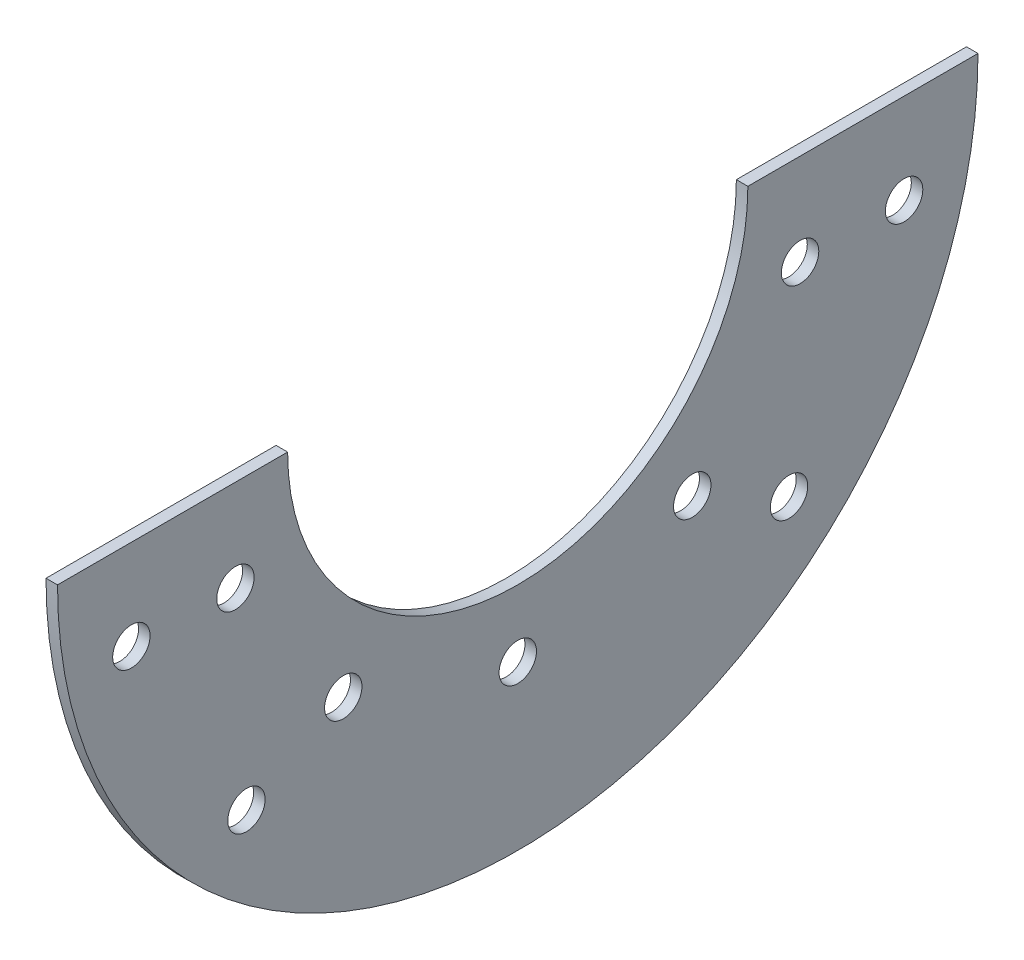
ISO-10303-21;
HEADER;
FILE_DESCRIPTION(('STEP AP214'),'2;1');
FILE_NAME('part.step','',(''),(''),'','','');
FILE_SCHEMA(('AUTOMOTIVE_DESIGN { 1 0 10303 214 1 1 1 1 }'));
ENDSEC;
DATA;
#1=APPLICATION_CONTEXT('core data for automotive mechanical design processes');
#2=APPLICATION_PROTOCOL_DEFINITION('international standard','automotive_design',2000,#1);
#3=PRODUCT_CONTEXT('',#1,'mechanical');
#4=PRODUCT('Part','Part','',(#3));
#5=PRODUCT_RELATED_PRODUCT_CATEGORY('part','',(#4));
#6=PRODUCT_DEFINITION_FORMATION('','',#4);
#7=PRODUCT_DEFINITION_CONTEXT('part definition',#1,'design');
#8=PRODUCT_DEFINITION('design','',#6,#7);
#9=PRODUCT_DEFINITION_SHAPE('','',#8);
#10=(LENGTH_UNIT() NAMED_UNIT(*) SI_UNIT(.MILLI.,.METRE.));
#11=(NAMED_UNIT(*) PLANE_ANGLE_UNIT() SI_UNIT($,.RADIAN.));
#12=(NAMED_UNIT(*) SI_UNIT($,.STERADIAN.) SOLID_ANGLE_UNIT());
#13=UNCERTAINTY_MEASURE_WITH_UNIT(LENGTH_MEASURE(1.E-05),#10,'distance_accuracy_value','');
#14=(GEOMETRIC_REPRESENTATION_CONTEXT(3) GLOBAL_UNCERTAINTY_ASSIGNED_CONTEXT((#13)) GLOBAL_UNIT_ASSIGNED_CONTEXT((#10,
#11,#12)) REPRESENTATION_CONTEXT('',''));
#15=CARTESIAN_POINT('',(0.,0.,0.));
#16=DIRECTION('',(0.,0.,1.));
#17=DIRECTION('',(1.,0.,0.));
#18=AXIS2_PLACEMENT_3D('',#15,#16,#17);
#19=CARTESIAN_POINT('',(0.,0.,0.));
#20=DIRECTION('',(0.,1.,0.));
#21=DIRECTION('',(0.,0.,1.));
#22=AXIS2_PLACEMENT_3D('',#19,#20,#21);
#23=PLANE('',#22);
#24=DIRECTION('',(0.,0.,1.));
#25=VECTOR('',#24,1.);
#26=CARTESIAN_POINT('',(2.,0.,0.));
#27=LINE('',#26,#25);
#28=CARTESIAN_POINT('',(2.,0.,-80.));
#29=VERTEX_POINT('',#28);
#30=CARTESIAN_POINT('',(2.,0.,-40.));
#31=VERTEX_POINT('',#30);
#32=EDGE_CURVE('E79',#29,#31,#27,.T.);
#33=ORIENTED_EDGE('',*,*,#32,.F.);
#34=DIRECTION('',(-1.,0.,0.));
#35=VECTOR('',#34,1.);
#36=CARTESIAN_POINT('',(2.,0.,-80.));
#37=LINE('',#36,#35);
#38=CARTESIAN_POINT('',(0.,0.,-80.));
#39=VERTEX_POINT('',#38);
#40=EDGE_CURVE('E88',#29,#39,#37,.T.);
#41=ORIENTED_EDGE('',*,*,#40,.T.);
#42=DIRECTION('',(0.,0.,1.));
#43=VECTOR('',#42,1.);
#44=CARTESIAN_POINT('',(0.,0.,0.));
#45=LINE('',#44,#43);
#46=CARTESIAN_POINT('',(0.,0.,-40.));
#47=VERTEX_POINT('',#46);
#48=EDGE_CURVE('E89',#39,#47,#45,.T.);
#49=ORIENTED_EDGE('',*,*,#48,.T.);
#50=DIRECTION('',(-1.,0.,0.));
#51=VECTOR('',#50,1.);
#52=CARTESIAN_POINT('',(2.,0.,-40.));
#53=LINE('',#52,#51);
#54=EDGE_CURVE('E49',#31,#47,#53,.T.);
#55=ORIENTED_EDGE('',*,*,#54,.F.);
#56=EDGE_LOOP('',(#33,#41,#49,#55));
#57=FACE_BOUND('',#56,.T.);
#58=ADVANCED_FACE('F32',(#57),#23,.T.);
#59=CARTESIAN_POINT('',(0.,0.,40.));
#60=VERTEX_POINT('',#59);
#61=CARTESIAN_POINT('',(0.,0.,80.));
#62=VERTEX_POINT('',#61);
#63=EDGE_CURVE('E93',#60,#62,#45,.T.);
#64=ORIENTED_EDGE('',*,*,#63,.T.);
#65=DIRECTION('',(-1.,0.,0.));
#66=VECTOR('',#65,1.);
#67=CARTESIAN_POINT('',(2.,0.,80.));
#68=LINE('',#67,#66);
#69=CARTESIAN_POINT('',(2.,0.,80.));
#70=VERTEX_POINT('',#69);
#71=EDGE_CURVE('E94',#62,#70,#68,.F.);
#72=ORIENTED_EDGE('',*,*,#71,.T.);
#73=CARTESIAN_POINT('',(2.,0.,40.));
#74=VERTEX_POINT('',#73);
#75=EDGE_CURVE('E80',#74,#70,#27,.T.);
#76=ORIENTED_EDGE('',*,*,#75,.F.);
#77=DIRECTION('',(-1.,0.,0.));
#78=VECTOR('',#77,1.);
#79=CARTESIAN_POINT('',(2.,0.,40.));
#80=LINE('',#79,#78);
#81=EDGE_CURVE('E57',#60,#74,#80,.F.);
#82=ORIENTED_EDGE('',*,*,#81,.F.);
#83=EDGE_LOOP('',(#64,#72,#76,#82));
#84=FACE_BOUND('',#83,.T.);
#85=ADVANCED_FACE('F160',(#84),#23,.T.);
#86=CARTESIAN_POINT('',(2.,-15.9452769097473,-49.0745162408299));
#87=DIRECTION('',(-1.,0.,0.));
#88=DIRECTION('',(0.,0.,1.));
#89=AXIS2_PLACEMENT_3D('',#86,#87,#88);
#90=CYLINDRICAL_SURFACE('',#89,3.25000000000001);
#91=CARTESIAN_POINT('',(2.,-15.9452769097473,-49.0745162408299));
#92=DIRECTION('',(1.,0.,0.));
#93=DIRECTION('',(0.,0.,-1.));
#94=AXIS2_PLACEMENT_3D('',#91,#92,#93);
#95=CIRCLE('',#94,3.25000000000001);
#96=CARTESIAN_POINT('',(2.,-15.9452769097473,-52.3245162408299));
#97=VERTEX_POINT('',#96);
#98=EDGE_CURVE('E102',#97,#97,#95,.T.);
#99=ORIENTED_EDGE('',*,*,#98,.T.);
#100=EDGE_LOOP('',(#99));
#101=FACE_BOUND('',#100,.T.);
#102=CARTESIAN_POINT('',(0.,-15.9452769097473,-49.0745162408299));
#103=DIRECTION('',(1.,0.,0.));
#104=DIRECTION('',(0.,0.,-1.));
#105=AXIS2_PLACEMENT_3D('',#102,#103,#104);
#106=CIRCLE('',#105,3.25000000000001);
#107=CARTESIAN_POINT('',(0.,-15.9452769097473,-52.3245162408299));
#108=VERTEX_POINT('',#107);
#109=EDGE_CURVE('E106',#108,#108,#106,.T.);
#110=ORIENTED_EDGE('',*,*,#109,.F.);
#111=EDGE_LOOP('',(#110));
#112=FACE_BOUND('',#111,.T.);
#113=ADVANCED_FACE('F162',(#101,#112),#90,.F.);
#114=CARTESIAN_POINT('',(2.,-41.7452769097473,-30.3297190182916));
#115=DIRECTION('',(-1.,0.,0.));
#116=DIRECTION('',(0.,0.,1.));
#117=AXIS2_PLACEMENT_3D('',#114,#115,#116);
#118=CYLINDRICAL_SURFACE('',#117,3.24999999999999);
#119=CARTESIAN_POINT('',(2.,-41.7452769097473,-30.3297190182916));
#120=DIRECTION('',(1.,0.,0.));
#121=DIRECTION('',(0.,0.,-1.));
#122=AXIS2_PLACEMENT_3D('',#119,#120,#121);
#123=CIRCLE('',#122,3.24999999999999);
#124=CARTESIAN_POINT('',(2.,-41.7452769097473,-33.5797190182916));
#125=VERTEX_POINT('',#124);
#126=EDGE_CURVE('E111',#125,#125,#123,.T.);
#127=ORIENTED_EDGE('',*,*,#126,.T.);
#128=EDGE_LOOP('',(#127));
#129=FACE_BOUND('',#128,.T.);
#130=CARTESIAN_POINT('',(0.,-41.7452769097473,-30.3297190182916));
#131=DIRECTION('',(1.,0.,0.));
#132=DIRECTION('',(0.,0.,-1.));
#133=AXIS2_PLACEMENT_3D('',#130,#131,#132);
#134=CIRCLE('',#133,3.24999999999999);
#135=CARTESIAN_POINT('',(0.,-41.7452769097473,-33.5797190182916));
#136=VERTEX_POINT('',#135);
#137=EDGE_CURVE('E114',#136,#136,#134,.T.);
#138=ORIENTED_EDGE('',*,*,#137,.F.);
#139=EDGE_LOOP('',(#138));
#140=FACE_BOUND('',#139,.T.);
#141=ADVANCED_FACE('F168',(#129,#140),#118,.F.);
#142=CARTESIAN_POINT('',(2.,-51.6,0.));
#143=DIRECTION('',(-1.,0.,0.));
#144=DIRECTION('',(0.,0.,1.));
#145=AXIS2_PLACEMENT_3D('',#142,#143,#144);
#146=CYLINDRICAL_SURFACE('',#145,3.25000000000001);
#147=CARTESIAN_POINT('',(2.,-51.6,0.));
#148=DIRECTION('',(1.,0.,0.));
#149=DIRECTION('',(0.,0.,-1.));
#150=AXIS2_PLACEMENT_3D('',#147,#148,#149);
#151=CIRCLE('',#150,3.25000000000001);
#152=CARTESIAN_POINT('',(2.,-51.6,-3.25000000000001));
#153=VERTEX_POINT('',#152);
#154=EDGE_CURVE('E117',#153,#153,#151,.T.);
#155=ORIENTED_EDGE('',*,*,#154,.T.);
#156=EDGE_LOOP('',(#155));
#157=FACE_BOUND('',#156,.T.);
#158=CARTESIAN_POINT('',(0.,-51.6,0.));
#159=DIRECTION('',(1.,0.,0.));
#160=DIRECTION('',(0.,0.,-1.));
#161=AXIS2_PLACEMENT_3D('',#158,#159,#160);
#162=CIRCLE('',#161,3.25000000000001);
#163=CARTESIAN_POINT('',(0.,-51.6,-3.25000000000001));
#164=VERTEX_POINT('',#163);
#165=EDGE_CURVE('E120',#164,#164,#162,.T.);
#166=ORIENTED_EDGE('',*,*,#165,.F.);
#167=EDGE_LOOP('',(#166));
#168=FACE_BOUND('',#167,.T.);
#169=ADVANCED_FACE('F245',(#157,#168),#146,.F.);
#170=CARTESIAN_POINT('',(2.,-41.7452769097473,30.3297190182916));
#171=DIRECTION('',(-1.,0.,0.));
#172=DIRECTION('',(0.,0.,1.));
#173=AXIS2_PLACEMENT_3D('',#170,#171,#172);
#174=CYLINDRICAL_SURFACE('',#173,3.25000000000001);
#175=CARTESIAN_POINT('',(2.,-41.7452769097473,30.3297190182916));
#176=DIRECTION('',(1.,0.,0.));
#177=DIRECTION('',(0.,0.,-1.));
#178=AXIS2_PLACEMENT_3D('',#175,#176,#177);
#179=CIRCLE('',#178,3.25000000000001);
#180=CARTESIAN_POINT('',(2.,-41.7452769097473,27.0797190182916));
#181=VERTEX_POINT('',#180);
#182=EDGE_CURVE('E123',#181,#181,#179,.T.);
#183=ORIENTED_EDGE('',*,*,#182,.T.);
#184=EDGE_LOOP('',(#183));
#185=FACE_BOUND('',#184,.T.);
#186=CARTESIAN_POINT('',(0.,-41.7452769097473,30.3297190182916));
#187=DIRECTION('',(1.,0.,0.));
#188=DIRECTION('',(0.,0.,-1.));
#189=AXIS2_PLACEMENT_3D('',#186,#187,#188);
#190=CIRCLE('',#189,3.25000000000001);
#191=CARTESIAN_POINT('',(0.,-41.7452769097473,27.0797190182916));
#192=VERTEX_POINT('',#191);
#193=EDGE_CURVE('E126',#192,#192,#190,.T.);
#194=ORIENTED_EDGE('',*,*,#193,.F.);
#195=EDGE_LOOP('',(#194));
#196=FACE_BOUND('',#195,.T.);
#197=ADVANCED_FACE('F236',(#185,#196),#174,.F.);
#198=CARTESIAN_POINT('',(2.,-15.9452769097473,49.0745162408299));
#199=DIRECTION('',(-1.,0.,0.));
#200=DIRECTION('',(0.,0.,1.));
#201=AXIS2_PLACEMENT_3D('',#198,#199,#200);
#202=CYLINDRICAL_SURFACE('',#201,3.25);
#203=CARTESIAN_POINT('',(2.,-15.9452769097473,49.0745162408299));
#204=DIRECTION('',(1.,0.,0.));
#205=DIRECTION('',(0.,0.,-1.));
#206=AXIS2_PLACEMENT_3D('',#203,#204,#205);
#207=CIRCLE('',#206,3.25);
#208=CARTESIAN_POINT('',(2.,-15.9452769097473,45.8245162408299));
#209=VERTEX_POINT('',#208);
#210=EDGE_CURVE('E129',#209,#209,#207,.T.);
#211=ORIENTED_EDGE('',*,*,#210,.T.);
#212=EDGE_LOOP('',(#211));
#213=FACE_BOUND('',#212,.T.);
#214=CARTESIAN_POINT('',(0.,-15.9452769097473,49.0745162408299));
#215=DIRECTION('',(1.,0.,0.));
#216=DIRECTION('',(0.,0.,-1.));
#217=AXIS2_PLACEMENT_3D('',#214,#215,#216);
#218=CIRCLE('',#217,3.25);
#219=CARTESIAN_POINT('',(0.,-15.9452769097473,45.8245162408299));
#220=VERTEX_POINT('',#219);
#221=EDGE_CURVE('E132',#220,#220,#218,.T.);
#222=ORIENTED_EDGE('',*,*,#221,.F.);
#223=EDGE_LOOP('',(#222));
#224=FACE_BOUND('',#223,.T.);
#225=ADVANCED_FACE('F227',(#213,#224),#202,.F.);
#226=CARTESIAN_POINT('',(2.,-15.6794919243112,-67.157676649773));
#227=DIRECTION('',(-1.,0.,0.));
#228=DIRECTION('',(0.,0.,1.));
#229=AXIS2_PLACEMENT_3D('',#226,#227,#228);
#230=CYLINDRICAL_SURFACE('',#229,3.25000000000001);
#231=CARTESIAN_POINT('',(2.,-15.6794919243112,-67.157676649773));
#232=DIRECTION('',(1.,0.,0.));
#233=DIRECTION('',(0.,0.,-1.));
#234=AXIS2_PLACEMENT_3D('',#231,#232,#233);
#235=CIRCLE('',#234,3.25000000000001);
#236=CARTESIAN_POINT('',(2.,-15.6794919243112,-70.407676649773));
#237=VERTEX_POINT('',#236);
#238=EDGE_CURVE('E135',#237,#237,#235,.T.);
#239=ORIENTED_EDGE('',*,*,#238,.T.);
#240=EDGE_LOOP('',(#239));
#241=FACE_BOUND('',#240,.T.);
#242=CARTESIAN_POINT('',(0.,-15.6794919243112,-67.157676649773));
#243=DIRECTION('',(1.,0.,0.));
#244=DIRECTION('',(0.,0.,-1.));
#245=AXIS2_PLACEMENT_3D('',#242,#243,#244);
#246=CIRCLE('',#245,3.25000000000001);
#247=CARTESIAN_POINT('',(0.,-15.6794919243112,-70.407676649773));
#248=VERTEX_POINT('',#247);
#249=EDGE_CURVE('E138',#248,#248,#246,.T.);
#250=ORIENTED_EDGE('',*,*,#249,.F.);
#251=EDGE_LOOP('',(#250));
#252=FACE_BOUND('',#251,.T.);
#253=ADVANCED_FACE('F218',(#241,#252),#230,.F.);
#254=CARTESIAN_POINT('',(2.,-50.3205080756888,-47.157676649773));
#255=DIRECTION('',(-1.,0.,0.));
#256=DIRECTION('',(0.,0.,1.));
#257=AXIS2_PLACEMENT_3D('',#254,#255,#256);
#258=CYLINDRICAL_SURFACE('',#257,3.25);
#259=CARTESIAN_POINT('',(2.,-50.3205080756888,-47.157676649773));
#260=DIRECTION('',(1.,0.,0.));
#261=DIRECTION('',(0.,0.,-1.));
#262=AXIS2_PLACEMENT_3D('',#259,#260,#261);
#263=CIRCLE('',#262,3.25);
#264=CARTESIAN_POINT('',(2.,-50.3205080756888,-50.407676649773));
#265=VERTEX_POINT('',#264);
#266=EDGE_CURVE('E141',#265,#265,#263,.T.);
#267=ORIENTED_EDGE('',*,*,#266,.T.);
#268=EDGE_LOOP('',(#267));
#269=FACE_BOUND('',#268,.T.);
#270=CARTESIAN_POINT('',(0.,-50.3205080756888,-47.157676649773));
#271=DIRECTION('',(1.,0.,0.));
#272=DIRECTION('',(0.,0.,-1.));
#273=AXIS2_PLACEMENT_3D('',#270,#271,#272);
#274=CIRCLE('',#273,3.25);
#275=CARTESIAN_POINT('',(0.,-50.3205080756888,-50.407676649773));
#276=VERTEX_POINT('',#275);
#277=EDGE_CURVE('E144',#276,#276,#274,.T.);
#278=ORIENTED_EDGE('',*,*,#277,.F.);
#279=EDGE_LOOP('',(#278));
#280=FACE_BOUND('',#279,.T.);
#281=ADVANCED_FACE('F210',(#269,#280),#258,.F.);
#282=CARTESIAN_POINT('',(2.,-50.3205080756888,47.1576766497729));
#283=DIRECTION('',(-1.,0.,0.));
#284=DIRECTION('',(0.,0.,1.));
#285=AXIS2_PLACEMENT_3D('',#282,#283,#284);
#286=CYLINDRICAL_SURFACE('',#285,3.25);
#287=CARTESIAN_POINT('',(2.,-50.3205080756888,47.1576766497729));
#288=DIRECTION('',(1.,0.,0.));
#289=DIRECTION('',(0.,0.,-1.));
#290=AXIS2_PLACEMENT_3D('',#287,#288,#289);
#291=CIRCLE('',#290,3.25);
#292=CARTESIAN_POINT('',(2.,-50.3205080756888,43.9076766497729));
#293=VERTEX_POINT('',#292);
#294=EDGE_CURVE('E147',#293,#293,#291,.T.);
#295=ORIENTED_EDGE('',*,*,#294,.T.);
#296=EDGE_LOOP('',(#295));
#297=FACE_BOUND('',#296,.T.);
#298=CARTESIAN_POINT('',(0.,-50.3205080756888,47.1576766497729));
#299=DIRECTION('',(1.,0.,0.));
#300=DIRECTION('',(0.,0.,-1.));
#301=AXIS2_PLACEMENT_3D('',#298,#299,#300);
#302=CIRCLE('',#301,3.25);
#303=CARTESIAN_POINT('',(0.,-50.3205080756888,43.9076766497729));
#304=VERTEX_POINT('',#303);
#305=EDGE_CURVE('E150',#304,#304,#302,.T.);
#306=ORIENTED_EDGE('',*,*,#305,.F.);
#307=EDGE_LOOP('',(#306));
#308=FACE_BOUND('',#307,.T.);
#309=ADVANCED_FACE('F202',(#297,#308),#286,.F.);
#310=CARTESIAN_POINT('',(2.,-15.6794919243113,67.157676649773));
#311=DIRECTION('',(-1.,0.,0.));
#312=DIRECTION('',(0.,0.,1.));
#313=AXIS2_PLACEMENT_3D('',#310,#311,#312);
#314=CYLINDRICAL_SURFACE('',#313,3.25000000000001);
#315=CARTESIAN_POINT('',(2.,-15.6794919243113,67.157676649773));
#316=DIRECTION('',(1.,0.,0.));
#317=DIRECTION('',(0.,0.,-1.));
#318=AXIS2_PLACEMENT_3D('',#315,#316,#317);
#319=CIRCLE('',#318,3.25000000000001);
#320=CARTESIAN_POINT('',(2.,-15.6794919243113,63.907676649773));
#321=VERTEX_POINT('',#320);
#322=EDGE_CURVE('E41',#321,#321,#319,.T.);
#323=ORIENTED_EDGE('',*,*,#322,.T.);
#324=EDGE_LOOP('',(#323));
#325=FACE_BOUND('',#324,.T.);
#326=CARTESIAN_POINT('',(0.,-15.6794919243113,67.157676649773));
#327=DIRECTION('',(1.,0.,0.));
#328=DIRECTION('',(0.,0.,-1.));
#329=AXIS2_PLACEMENT_3D('',#326,#327,#328);
#330=CIRCLE('',#329,3.25000000000001);
#331=CARTESIAN_POINT('',(0.,-15.6794919243113,63.907676649773));
#332=VERTEX_POINT('',#331);
#333=EDGE_CURVE('E11',#332,#332,#330,.T.);
#334=ORIENTED_EDGE('',*,*,#333,.F.);
#335=EDGE_LOOP('',(#334));
#336=FACE_BOUND('',#335,.T.);
#337=ADVANCED_FACE('F172',(#325,#336),#314,.F.);
#338=CARTESIAN_POINT('',(0.,0.,0.));
#339=DIRECTION('',(1.,0.,0.));
#340=DIRECTION('',(0.,0.,-1.));
#341=AXIS2_PLACEMENT_3D('',#338,#339,#340);
#342=PLANE('',#341);
#343=ORIENTED_EDGE('',*,*,#333,.T.);
#344=EDGE_LOOP('',(#343));
#345=FACE_BOUND('',#344,.T.);
#346=ORIENTED_EDGE('',*,*,#305,.T.);
#347=EDGE_LOOP('',(#346));
#348=FACE_BOUND('',#347,.T.);
#349=ORIENTED_EDGE('',*,*,#277,.T.);
#350=EDGE_LOOP('',(#349));
#351=FACE_BOUND('',#350,.T.);
#352=ORIENTED_EDGE('',*,*,#249,.T.);
#353=EDGE_LOOP('',(#352));
#354=FACE_BOUND('',#353,.T.);
#355=ORIENTED_EDGE('',*,*,#221,.T.);
#356=EDGE_LOOP('',(#355));
#357=FACE_BOUND('',#356,.T.);
#358=ORIENTED_EDGE('',*,*,#193,.T.);
#359=EDGE_LOOP('',(#358));
#360=FACE_BOUND('',#359,.T.);
#361=ORIENTED_EDGE('',*,*,#165,.T.);
#362=EDGE_LOOP('',(#361));
#363=FACE_BOUND('',#362,.T.);
#364=ORIENTED_EDGE('',*,*,#137,.T.);
#365=EDGE_LOOP('',(#364));
#366=FACE_BOUND('',#365,.T.);
#367=ORIENTED_EDGE('',*,*,#109,.T.);
#368=EDGE_LOOP('',(#367));
#369=FACE_BOUND('',#368,.T.);
#370=ORIENTED_EDGE('',*,*,#48,.F.);
#371=CARTESIAN_POINT('',(0.,0.,0.));
#372=DIRECTION('',(1.,0.,0.));
#373=DIRECTION('',(0.,0.,-1.));
#374=AXIS2_PLACEMENT_3D('',#371,#372,#373);
#375=CIRCLE('',#374,80.);
#376=EDGE_CURVE('E85',#62,#39,#375,.T.);
#377=ORIENTED_EDGE('',*,*,#376,.F.);
#378=ORIENTED_EDGE('',*,*,#63,.F.);
#379=CARTESIAN_POINT('',(0.,0.,0.));
#380=DIRECTION('',(1.,0.,0.));
#381=DIRECTION('',(0.,0.,-1.));
#382=AXIS2_PLACEMENT_3D('',#379,#380,#381);
#383=CIRCLE('',#382,40.);
#384=EDGE_CURVE('E36',#60,#47,#383,.T.);
#385=ORIENTED_EDGE('',*,*,#384,.T.);
#386=EDGE_LOOP('',(#370,#377,#378,#385));
#387=FACE_BOUND('',#386,.T.);
#388=ADVANCED_FACE('F158',(#345,#348,#351,#354,#357,#360,#363,#366,#369,#387),#342,.F.);
#389=CARTESIAN_POINT('',(2.,0.,0.));
#390=DIRECTION('',(1.,0.,0.));
#391=DIRECTION('',(0.,0.,-1.));
#392=AXIS2_PLACEMENT_3D('',#389,#390,#391);
#393=PLANE('',#392);
#394=ORIENTED_EDGE('',*,*,#322,.F.);
#395=EDGE_LOOP('',(#394));
#396=FACE_BOUND('',#395,.T.);
#397=ORIENTED_EDGE('',*,*,#266,.F.);
#398=EDGE_LOOP('',(#397));
#399=FACE_BOUND('',#398,.T.);
#400=ORIENTED_EDGE('',*,*,#210,.F.);
#401=EDGE_LOOP('',(#400));
#402=FACE_BOUND('',#401,.T.);
#403=ORIENTED_EDGE('',*,*,#154,.F.);
#404=EDGE_LOOP('',(#403));
#405=FACE_BOUND('',#404,.T.);
#406=ORIENTED_EDGE('',*,*,#98,.F.);
#407=EDGE_LOOP('',(#406));
#408=FACE_BOUND('',#407,.T.);
#409=ORIENTED_EDGE('',*,*,#126,.F.);
#410=EDGE_LOOP('',(#409));
#411=FACE_BOUND('',#410,.T.);
#412=ORIENTED_EDGE('',*,*,#182,.F.);
#413=EDGE_LOOP('',(#412));
#414=FACE_BOUND('',#413,.T.);
#415=ORIENTED_EDGE('',*,*,#238,.F.);
#416=EDGE_LOOP('',(#415));
#417=FACE_BOUND('',#416,.T.);
#418=ORIENTED_EDGE('',*,*,#294,.F.);
#419=EDGE_LOOP('',(#418));
#420=FACE_BOUND('',#419,.T.);
#421=CARTESIAN_POINT('',(2.,0.,0.));
#422=DIRECTION('',(1.,0.,0.));
#423=DIRECTION('',(0.,0.,-1.));
#424=AXIS2_PLACEMENT_3D('',#421,#422,#423);
#425=CIRCLE('',#424,80.);
#426=EDGE_CURVE('E76',#70,#29,#425,.T.);
#427=ORIENTED_EDGE('',*,*,#426,.T.);
#428=ORIENTED_EDGE('',*,*,#32,.T.);
#429=CARTESIAN_POINT('',(2.,0.,0.));
#430=DIRECTION('',(1.,0.,0.));
#431=DIRECTION('',(0.,0.,-1.));
#432=AXIS2_PLACEMENT_3D('',#429,#430,#431);
#433=CIRCLE('',#432,40.);
#434=EDGE_CURVE('E100',#74,#31,#433,.T.);
#435=ORIENTED_EDGE('',*,*,#434,.F.);
#436=ORIENTED_EDGE('',*,*,#75,.T.);
#437=EDGE_LOOP('',(#427,#428,#435,#436));
#438=FACE_BOUND('',#437,.T.);
#439=ADVANCED_FACE('F77',(#396,#399,#402,#405,#408,#411,#414,#417,#420,#438),#393,.T.);
#440=CARTESIAN_POINT('',(2.,0.,0.));
#441=DIRECTION('',(-1.,0.,0.));
#442=DIRECTION('',(0.,0.,1.));
#443=AXIS2_PLACEMENT_3D('',#440,#441,#442);
#444=CYLINDRICAL_SURFACE('',#443,40.);
#445=ORIENTED_EDGE('',*,*,#434,.T.);
#446=ORIENTED_EDGE('',*,*,#54,.T.);
#447=ORIENTED_EDGE('',*,*,#384,.F.);
#448=ORIENTED_EDGE('',*,*,#81,.T.);
#449=EDGE_LOOP('',(#445,#446,#447,#448));
#450=FACE_BOUND('',#449,.T.);
#451=ADVANCED_FACE('F34',(#450),#444,.F.);
#452=CARTESIAN_POINT('',(2.,0.,0.));
#453=DIRECTION('',(-1.,0.,0.));
#454=DIRECTION('',(0.,0.,1.));
#455=AXIS2_PLACEMENT_3D('',#452,#453,#454);
#456=CYLINDRICAL_SURFACE('',#455,80.);
#457=ORIENTED_EDGE('',*,*,#40,.F.);
#458=ORIENTED_EDGE('',*,*,#426,.F.);
#459=ORIENTED_EDGE('',*,*,#71,.F.);
#460=ORIENTED_EDGE('',*,*,#376,.T.);
#461=EDGE_LOOP('',(#457,#458,#459,#460));
#462=FACE_BOUND('',#461,.T.);
#463=ADVANCED_FACE('F91',(#462),#456,.T.);
#464=CLOSED_SHELL('',(#58,#85,#113,#141,#169,#197,#225,#253,#281,#309,#337,#388,#439,#451,#463));
#465=MANIFOLD_SOLID_BREP('B2',#464);
#466=ADVANCED_BREP_SHAPE_REPRESENTATION('',(#18,#465),#14);
#467=SHAPE_DEFINITION_REPRESENTATION(#9,#466);
ENDSEC;
END-ISO-10303-21;
